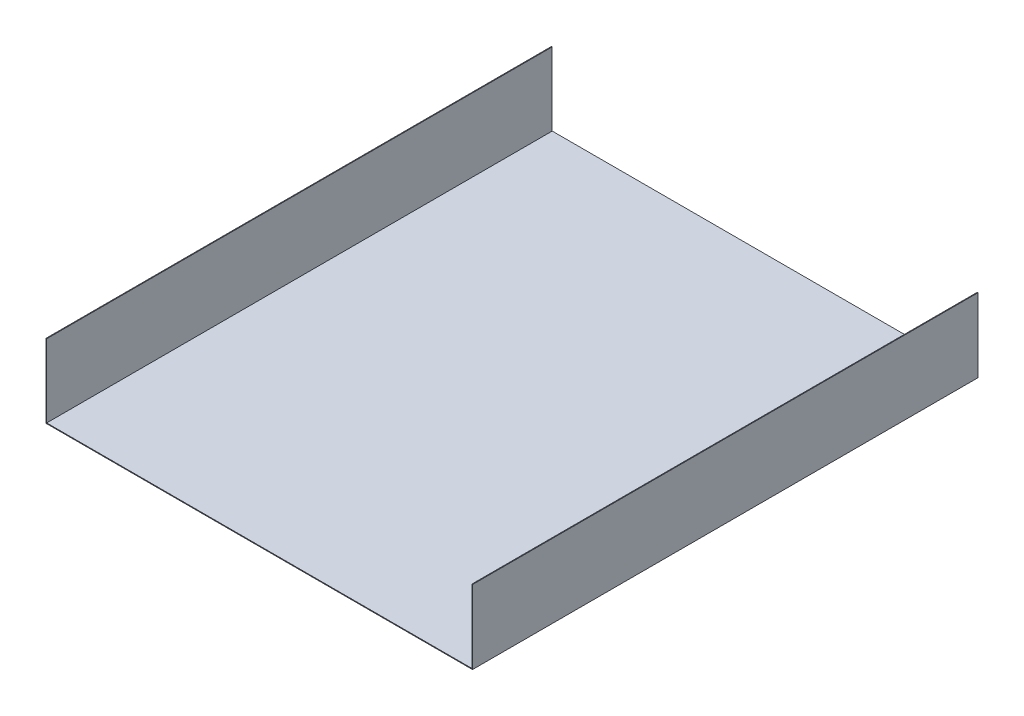
ISO-10303-21;
HEADER;
FILE_DESCRIPTION(('STEP AP214'),'2;1');
FILE_NAME('part.step','',(''),(''),'','','');
FILE_SCHEMA(('AUTOMOTIVE_DESIGN { 1 0 10303 214 1 1 1 1 }'));
ENDSEC;
DATA;
#1=APPLICATION_CONTEXT('core data for automotive mechanical design processes');
#2=APPLICATION_PROTOCOL_DEFINITION('international standard','automotive_design',2000,#1);
#3=PRODUCT_CONTEXT('',#1,'mechanical');
#4=PRODUCT('Part','Part','',(#3));
#5=PRODUCT_RELATED_PRODUCT_CATEGORY('part','',(#4));
#6=PRODUCT_DEFINITION_FORMATION('','',#4);
#7=PRODUCT_DEFINITION_CONTEXT('part definition',#1,'design');
#8=PRODUCT_DEFINITION('design','',#6,#7);
#9=PRODUCT_DEFINITION_SHAPE('','',#8);
#10=(LENGTH_UNIT() NAMED_UNIT(*) SI_UNIT(.MILLI.,.METRE.));
#11=(NAMED_UNIT(*) PLANE_ANGLE_UNIT() SI_UNIT($,.RADIAN.));
#12=(NAMED_UNIT(*) SI_UNIT($,.STERADIAN.) SOLID_ANGLE_UNIT());
#13=UNCERTAINTY_MEASURE_WITH_UNIT(LENGTH_MEASURE(1.E-05),#10,'distance_accuracy_value','');
#14=(GEOMETRIC_REPRESENTATION_CONTEXT(3) GLOBAL_UNCERTAINTY_ASSIGNED_CONTEXT((#13)) GLOBAL_UNIT_ASSIGNED_CONTEXT((#10,
#11,#12)) REPRESENTATION_CONTEXT('',''));
#15=CARTESIAN_POINT('',(0.,0.,0.));
#16=DIRECTION('',(0.,0.,1.));
#17=DIRECTION('',(1.,0.,0.));
#18=AXIS2_PLACEMENT_3D('',#15,#16,#17);
#19=CARTESIAN_POINT('',(14.7,106.,-700.));
#20=DIRECTION('',(0.,1.,0.));
#21=DIRECTION('',(0.,0.,1.));
#22=AXIS2_PLACEMENT_3D('',#19,#20,#21);
#23=PLANE('',#22);
#24=DIRECTION('',(-1.,0.,0.));
#25=VECTOR('',#24,1.);
#26=CARTESIAN_POINT('',(14.7,106.,0.));
#27=LINE('',#26,#25);
#28=CARTESIAN_POINT('',(14.7,106.,0.));
#29=VERTEX_POINT('',#28);
#30=CARTESIAN_POINT('',(13.7,106.,0.));
#31=VERTEX_POINT('',#30);
#32=EDGE_CURVE('E136',#29,#31,#27,.T.);
#33=ORIENTED_EDGE('',*,*,#32,.F.);
#34=DIRECTION('',(0.,0.,1.));
#35=VECTOR('',#34,1.);
#36=CARTESIAN_POINT('',(14.7,106.,-700.));
#37=LINE('',#36,#35);
#38=CARTESIAN_POINT('',(14.7,106.,-700.));
#39=VERTEX_POINT('',#38);
#40=EDGE_CURVE('E11',#39,#29,#37,.T.);
#41=ORIENTED_EDGE('',*,*,#40,.F.);
#42=DIRECTION('',(-1.,0.,0.));
#43=VECTOR('',#42,1.);
#44=CARTESIAN_POINT('',(14.7,106.,-700.));
#45=LINE('',#44,#43);
#46=CARTESIAN_POINT('',(13.7,106.,-700.));
#47=VERTEX_POINT('',#46);
#48=EDGE_CURVE('E156',#39,#47,#45,.T.);
#49=ORIENTED_EDGE('',*,*,#48,.T.);
#50=DIRECTION('',(0.,0.,1.));
#51=VECTOR('',#50,1.);
#52=CARTESIAN_POINT('',(13.7,106.,-700.));
#53=LINE('',#52,#51);
#54=EDGE_CURVE('E42',#47,#31,#53,.T.);
#55=ORIENTED_EDGE('',*,*,#54,.T.);
#56=EDGE_LOOP('',(#33,#41,#49,#55));
#57=FACE_BOUND('',#56,.T.);
#58=ADVANCED_FACE('F39',(#57),#23,.T.);
#59=CARTESIAN_POINT('',(14.7,5.,-700.));
#60=DIRECTION('',(1.,0.,0.));
#61=DIRECTION('',(0.,0.,-1.));
#62=AXIS2_PLACEMENT_3D('',#59,#60,#61);
#63=PLANE('',#62);
#64=DIRECTION('',(0.,1.,0.));
#65=VECTOR('',#64,1.);
#66=CARTESIAN_POINT('',(14.7,5.,0.));
#67=LINE('',#66,#65);
#68=CARTESIAN_POINT('',(14.7,5.,0.));
#69=VERTEX_POINT('',#68);
#70=EDGE_CURVE('E154',#69,#29,#67,.T.);
#71=ORIENTED_EDGE('',*,*,#70,.F.);
#72=DIRECTION('',(0.,0.,1.));
#73=VECTOR('',#72,1.);
#74=CARTESIAN_POINT('',(14.7,5.,-700.));
#75=LINE('',#74,#73);
#76=CARTESIAN_POINT('',(14.7,5.,-700.));
#77=VERTEX_POINT('',#76);
#78=EDGE_CURVE('E48',#77,#69,#75,.T.);
#79=ORIENTED_EDGE('',*,*,#78,.F.);
#80=DIRECTION('',(0.,1.,0.));
#81=VECTOR('',#80,1.);
#82=CARTESIAN_POINT('',(14.7,5.,-700.));
#83=LINE('',#82,#81);
#84=EDGE_CURVE('E126',#77,#39,#83,.T.);
#85=ORIENTED_EDGE('',*,*,#84,.T.);
#86=ORIENTED_EDGE('',*,*,#40,.T.);
#87=EDGE_LOOP('',(#71,#79,#85,#86));
#88=FACE_BOUND('',#87,.T.);
#89=ADVANCED_FACE('F168',(#88),#63,.T.);
#90=CARTESIAN_POINT('',(603.3,5.,-700.));
#91=DIRECTION('',(0.,1.,0.));
#92=DIRECTION('',(0.,0.,1.));
#93=AXIS2_PLACEMENT_3D('',#90,#91,#92);
#94=PLANE('',#93);
#95=DIRECTION('',(-1.,0.,0.));
#96=VECTOR('',#95,1.);
#97=CARTESIAN_POINT('',(603.3,5.,0.));
#98=LINE('',#97,#96);
#99=CARTESIAN_POINT('',(603.3,5.,0.));
#100=VERTEX_POINT('',#99);
#101=EDGE_CURVE('E113',#100,#69,#98,.T.);
#102=ORIENTED_EDGE('',*,*,#101,.F.);
#103=DIRECTION('',(0.,0.,1.));
#104=VECTOR('',#103,1.);
#105=CARTESIAN_POINT('',(603.3,5.,-700.));
#106=LINE('',#105,#104);
#107=CARTESIAN_POINT('',(603.3,5.,-700.));
#108=VERTEX_POINT('',#107);
#109=EDGE_CURVE('E108',#108,#100,#106,.T.);
#110=ORIENTED_EDGE('',*,*,#109,.F.);
#111=DIRECTION('',(-1.,0.,0.));
#112=VECTOR('',#111,1.);
#113=CARTESIAN_POINT('',(603.3,5.,-700.));
#114=LINE('',#113,#112);
#115=EDGE_CURVE('E111',#108,#77,#114,.T.);
#116=ORIENTED_EDGE('',*,*,#115,.T.);
#117=ORIENTED_EDGE('',*,*,#78,.T.);
#118=EDGE_LOOP('',(#102,#110,#116,#117));
#119=FACE_BOUND('',#118,.T.);
#120=ADVANCED_FACE('F110',(#119),#94,.T.);
#121=CARTESIAN_POINT('',(603.3,106.,-700.));
#122=DIRECTION('',(-1.,0.,0.));
#123=DIRECTION('',(0.,0.,1.));
#124=AXIS2_PLACEMENT_3D('',#121,#122,#123);
#125=PLANE('',#124);
#126=DIRECTION('',(0.,-1.,0.));
#127=VECTOR('',#126,1.);
#128=CARTESIAN_POINT('',(603.3,106.,0.));
#129=LINE('',#128,#127);
#130=CARTESIAN_POINT('',(603.3,106.,0.));
#131=VERTEX_POINT('',#130);
#132=EDGE_CURVE('E151',#131,#100,#129,.T.);
#133=ORIENTED_EDGE('',*,*,#132,.F.);
#134=DIRECTION('',(0.,0.,1.));
#135=VECTOR('',#134,1.);
#136=CARTESIAN_POINT('',(603.3,106.,-700.));
#137=LINE('',#136,#135);
#138=CARTESIAN_POINT('',(603.3,106.,-700.));
#139=VERTEX_POINT('',#138);
#140=EDGE_CURVE('E118',#139,#131,#137,.T.);
#141=ORIENTED_EDGE('',*,*,#140,.F.);
#142=DIRECTION('',(0.,-1.,0.));
#143=VECTOR('',#142,1.);
#144=CARTESIAN_POINT('',(603.3,106.,-700.));
#145=LINE('',#144,#143);
#146=EDGE_CURVE('E124',#139,#108,#145,.T.);
#147=ORIENTED_EDGE('',*,*,#146,.T.);
#148=ORIENTED_EDGE('',*,*,#109,.T.);
#149=EDGE_LOOP('',(#133,#141,#147,#148));
#150=FACE_BOUND('',#149,.T.);
#151=ADVANCED_FACE('F128',(#150),#125,.T.);
#152=CARTESIAN_POINT('',(604.3,106.,-700.));
#153=DIRECTION('',(0.,1.,0.));
#154=DIRECTION('',(0.,0.,1.));
#155=AXIS2_PLACEMENT_3D('',#152,#153,#154);
#156=PLANE('',#155);
#157=DIRECTION('',(-1.,0.,0.));
#158=VECTOR('',#157,1.);
#159=CARTESIAN_POINT('',(604.3,106.,0.));
#160=LINE('',#159,#158);
#161=CARTESIAN_POINT('',(604.3,106.,0.));
#162=VERTEX_POINT('',#161);
#163=EDGE_CURVE('E148',#162,#131,#160,.T.);
#164=ORIENTED_EDGE('',*,*,#163,.F.);
#165=DIRECTION('',(0.,0.,1.));
#166=VECTOR('',#165,1.);
#167=CARTESIAN_POINT('',(604.3,106.,-700.));
#168=LINE('',#167,#166);
#169=CARTESIAN_POINT('',(604.3,106.,-700.));
#170=VERTEX_POINT('',#169);
#171=EDGE_CURVE('E160',#170,#162,#168,.T.);
#172=ORIENTED_EDGE('',*,*,#171,.F.);
#173=DIRECTION('',(-1.,0.,0.));
#174=VECTOR('',#173,1.);
#175=CARTESIAN_POINT('',(604.3,106.,-700.));
#176=LINE('',#175,#174);
#177=EDGE_CURVE('E129',#170,#139,#176,.T.);
#178=ORIENTED_EDGE('',*,*,#177,.T.);
#179=ORIENTED_EDGE('',*,*,#140,.T.);
#180=EDGE_LOOP('',(#164,#172,#178,#179));
#181=FACE_BOUND('',#180,.T.);
#182=ADVANCED_FACE('F181',(#181),#156,.T.);
#183=CARTESIAN_POINT('',(604.3,4.,-700.));
#184=DIRECTION('',(1.,0.,0.));
#185=DIRECTION('',(0.,0.,-1.));
#186=AXIS2_PLACEMENT_3D('',#183,#184,#185);
#187=PLANE('',#186);
#188=DIRECTION('',(0.,1.,0.));
#189=VECTOR('',#188,1.);
#190=CARTESIAN_POINT('',(604.3,4.,0.));
#191=LINE('',#190,#189);
#192=CARTESIAN_POINT('',(604.3,4.,0.));
#193=VERTEX_POINT('',#192);
#194=EDGE_CURVE('E145',#193,#162,#191,.T.);
#195=ORIENTED_EDGE('',*,*,#194,.F.);
#196=DIRECTION('',(0.,0.,1.));
#197=VECTOR('',#196,1.);
#198=CARTESIAN_POINT('',(604.3,4.,-700.));
#199=LINE('',#198,#197);
#200=CARTESIAN_POINT('',(604.3,4.,-700.));
#201=VERTEX_POINT('',#200);
#202=EDGE_CURVE('E162',#201,#193,#199,.T.);
#203=ORIENTED_EDGE('',*,*,#202,.F.);
#204=DIRECTION('',(0.,1.,0.));
#205=VECTOR('',#204,1.);
#206=CARTESIAN_POINT('',(604.3,4.,-700.));
#207=LINE('',#206,#205);
#208=EDGE_CURVE('E131',#201,#170,#207,.T.);
#209=ORIENTED_EDGE('',*,*,#208,.T.);
#210=ORIENTED_EDGE('',*,*,#171,.T.);
#211=EDGE_LOOP('',(#195,#203,#209,#210));
#212=FACE_BOUND('',#211,.T.);
#213=ADVANCED_FACE('F184',(#212),#187,.T.);
#214=CARTESIAN_POINT('',(13.7,4.,-700.));
#215=DIRECTION('',(0.,-1.,0.));
#216=DIRECTION('',(0.,0.,-1.));
#217=AXIS2_PLACEMENT_3D('',#214,#215,#216);
#218=PLANE('',#217);
#219=DIRECTION('',(1.,0.,0.));
#220=VECTOR('',#219,1.);
#221=CARTESIAN_POINT('',(13.7,4.,0.));
#222=LINE('',#221,#220);
#223=CARTESIAN_POINT('',(13.7,4.,0.));
#224=VERTEX_POINT('',#223);
#225=EDGE_CURVE('E142',#224,#193,#222,.T.);
#226=ORIENTED_EDGE('',*,*,#225,.F.);
#227=DIRECTION('',(0.,0.,1.));
#228=VECTOR('',#227,1.);
#229=CARTESIAN_POINT('',(13.7,4.,-700.));
#230=LINE('',#229,#228);
#231=CARTESIAN_POINT('',(13.7,4.,-700.));
#232=VERTEX_POINT('',#231);
#233=EDGE_CURVE('E163',#232,#224,#230,.T.);
#234=ORIENTED_EDGE('',*,*,#233,.F.);
#235=DIRECTION('',(1.,0.,0.));
#236=VECTOR('',#235,1.);
#237=CARTESIAN_POINT('',(13.7,4.,-700.));
#238=LINE('',#237,#236);
#239=EDGE_CURVE('E259',#232,#201,#238,.T.);
#240=ORIENTED_EDGE('',*,*,#239,.T.);
#241=ORIENTED_EDGE('',*,*,#202,.T.);
#242=EDGE_LOOP('',(#226,#234,#240,#241));
#243=FACE_BOUND('',#242,.T.);
#244=ADVANCED_FACE('F188',(#243),#218,.T.);
#245=CARTESIAN_POINT('',(13.7,106.,-700.));
#246=DIRECTION('',(-1.,0.,0.));
#247=DIRECTION('',(0.,0.,1.));
#248=AXIS2_PLACEMENT_3D('',#245,#246,#247);
#249=PLANE('',#248);
#250=DIRECTION('',(0.,-1.,0.));
#251=VECTOR('',#250,1.);
#252=CARTESIAN_POINT('',(13.7,106.,0.));
#253=LINE('',#252,#251);
#254=EDGE_CURVE('E139',#31,#224,#253,.T.);
#255=ORIENTED_EDGE('',*,*,#254,.F.);
#256=ORIENTED_EDGE('',*,*,#54,.F.);
#257=DIRECTION('',(0.,-1.,0.));
#258=VECTOR('',#257,1.);
#259=CARTESIAN_POINT('',(13.7,106.,-700.));
#260=LINE('',#259,#258);
#261=EDGE_CURVE('E260',#47,#232,#260,.T.);
#262=ORIENTED_EDGE('',*,*,#261,.T.);
#263=ORIENTED_EDGE('',*,*,#233,.T.);
#264=EDGE_LOOP('',(#255,#256,#262,#263));
#265=FACE_BOUND('',#264,.T.);
#266=ADVANCED_FACE('F165',(#265),#249,.T.);
#267=CARTESIAN_POINT('',(0.,0.,-700.));
#268=DIRECTION('',(0.,0.,1.));
#269=DIRECTION('',(1.,0.,0.));
#270=AXIS2_PLACEMENT_3D('',#267,#268,#269);
#271=PLANE('',#270);
#272=ORIENTED_EDGE('',*,*,#48,.F.);
#273=ORIENTED_EDGE('',*,*,#84,.F.);
#274=ORIENTED_EDGE('',*,*,#115,.F.);
#275=ORIENTED_EDGE('',*,*,#146,.F.);
#276=ORIENTED_EDGE('',*,*,#177,.F.);
#277=ORIENTED_EDGE('',*,*,#208,.F.);
#278=ORIENTED_EDGE('',*,*,#239,.F.);
#279=ORIENTED_EDGE('',*,*,#261,.F.);
#280=EDGE_LOOP('',(#272,#273,#274,#275,#276,#277,#278,#279));
#281=FACE_BOUND('',#280,.T.);
#282=ADVANCED_FACE('F122',(#281),#271,.F.);
#283=CARTESIAN_POINT('',(0.,0.,0.));
#284=DIRECTION('',(0.,0.,1.));
#285=DIRECTION('',(1.,0.,0.));
#286=AXIS2_PLACEMENT_3D('',#283,#284,#285);
#287=PLANE('',#286);
#288=ORIENTED_EDGE('',*,*,#32,.T.);
#289=ORIENTED_EDGE('',*,*,#254,.T.);
#290=ORIENTED_EDGE('',*,*,#225,.T.);
#291=ORIENTED_EDGE('',*,*,#194,.T.);
#292=ORIENTED_EDGE('',*,*,#163,.T.);
#293=ORIENTED_EDGE('',*,*,#132,.T.);
#294=ORIENTED_EDGE('',*,*,#101,.T.);
#295=ORIENTED_EDGE('',*,*,#70,.T.);
#296=EDGE_LOOP('',(#288,#289,#290,#291,#292,#293,#294,#295));
#297=FACE_BOUND('',#296,.T.);
#298=ADVANCED_FACE('F167',(#297),#287,.T.);
#299=CLOSED_SHELL('',(#58,#89,#120,#151,#182,#213,#244,#266,#282,#298));
#300=MANIFOLD_SOLID_BREP('B2',#299);
#301=ADVANCED_BREP_SHAPE_REPRESENTATION('',(#18,#300),#14);
#302=SHAPE_DEFINITION_REPRESENTATION(#9,#301);
ENDSEC;
END-ISO-10303-21;
